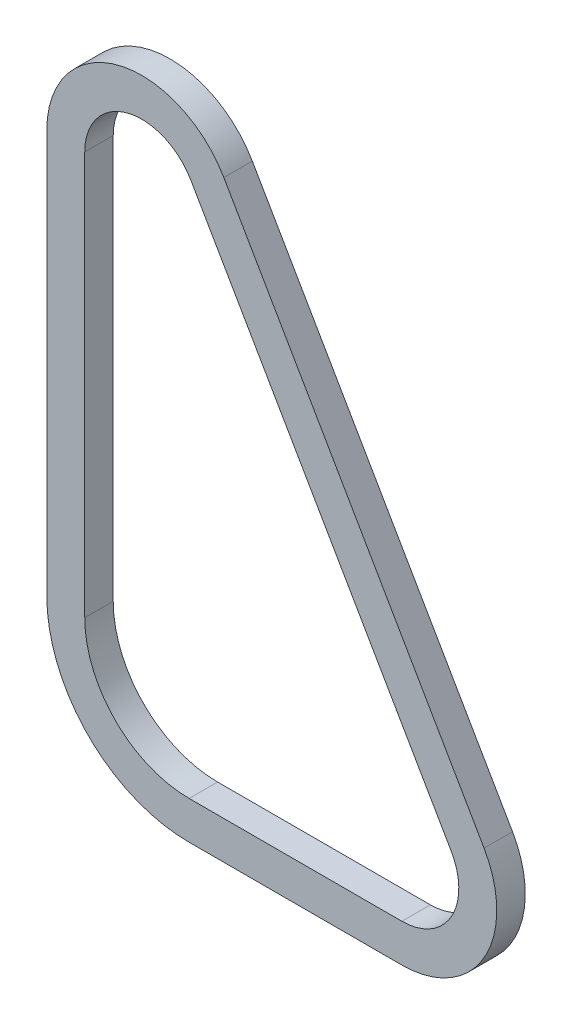
ISO-10303-21;
HEADER;
FILE_DESCRIPTION(('STEP AP214'),'2;1');
FILE_NAME('part.step','',(''),(''),'','','');
FILE_SCHEMA(('AUTOMOTIVE_DESIGN { 1 0 10303 214 1 1 1 1 }'));
ENDSEC;
DATA;
#1=APPLICATION_CONTEXT('core data for automotive mechanical design processes');
#2=APPLICATION_PROTOCOL_DEFINITION('international standard','automotive_design',2000,#1);
#3=PRODUCT_CONTEXT('',#1,'mechanical');
#4=PRODUCT('Part','Part','',(#3));
#5=PRODUCT_RELATED_PRODUCT_CATEGORY('part','',(#4));
#6=PRODUCT_DEFINITION_FORMATION('','',#4);
#7=PRODUCT_DEFINITION_CONTEXT('part definition',#1,'design');
#8=PRODUCT_DEFINITION('design','',#6,#7);
#9=PRODUCT_DEFINITION_SHAPE('','',#8);
#10=(LENGTH_UNIT() NAMED_UNIT(*) SI_UNIT(.MILLI.,.METRE.));
#11=(NAMED_UNIT(*) PLANE_ANGLE_UNIT() SI_UNIT($,.RADIAN.));
#12=(NAMED_UNIT(*) SI_UNIT($,.STERADIAN.) SOLID_ANGLE_UNIT());
#13=UNCERTAINTY_MEASURE_WITH_UNIT(LENGTH_MEASURE(1.E-05),#10,'distance_accuracy_value','');
#14=(GEOMETRIC_REPRESENTATION_CONTEXT(3) GLOBAL_UNCERTAINTY_ASSIGNED_CONTEXT((#13)) GLOBAL_UNIT_ASSIGNED_CONTEXT((#10,
#11,#12)) REPRESENTATION_CONTEXT('',''));
#15=CARTESIAN_POINT('',(0.,0.,0.));
#16=DIRECTION('',(0.,0.,1.));
#17=DIRECTION('',(1.,0.,0.));
#18=AXIS2_PLACEMENT_3D('',#15,#16,#17);
#19=CARTESIAN_POINT('',(-50.,0.,30.));
#20=DIRECTION('',(-1.,0.,0.));
#21=DIRECTION('',(0.,-1.,0.));
#22=AXIS2_PLACEMENT_3D('',#19,#20,#21);
#23=PLANE('',#22);
#24=DIRECTION('',(0.,1.,0.));
#25=VECTOR('',#24,1.);
#26=CARTESIAN_POINT('',(-50.,0.,0.));
#27=LINE('',#26,#25);
#28=CARTESIAN_POINT('',(-50.,-425.,0.));
#29=VERTEX_POINT('',#28);
#30=CARTESIAN_POINT('',(-50.,0.,0.));
#31=VERTEX_POINT('',#30);
#32=EDGE_CURVE('E190',#29,#31,#27,.T.);
#33=ORIENTED_EDGE('',*,*,#32,.F.);
#34=DIRECTION('',(0.,0.,-1.));
#35=VECTOR('',#34,1.);
#36=CARTESIAN_POINT('',(-50.,-425.,30.));
#37=LINE('',#36,#35);
#38=CARTESIAN_POINT('',(-50.,-425.,30.));
#39=VERTEX_POINT('',#38);
#40=EDGE_CURVE('E11',#39,#29,#37,.T.);
#41=ORIENTED_EDGE('',*,*,#40,.F.);
#42=DIRECTION('',(0.,1.,0.));
#43=VECTOR('',#42,1.);
#44=CARTESIAN_POINT('',(-50.,0.,30.));
#45=LINE('',#44,#43);
#46=CARTESIAN_POINT('',(-50.,0.,30.));
#47=VERTEX_POINT('',#46);
#48=EDGE_CURVE('E280',#39,#47,#45,.T.);
#49=ORIENTED_EDGE('',*,*,#48,.T.);
#50=DIRECTION('',(0.,0.,-1.));
#51=VECTOR('',#50,1.);
#52=CARTESIAN_POINT('',(-50.,0.,30.));
#53=LINE('',#52,#51);
#54=EDGE_CURVE('E59',#47,#31,#53,.T.);
#55=ORIENTED_EDGE('',*,*,#54,.T.);
#56=EDGE_LOOP('',(#33,#41,#49,#55));
#57=FACE_BOUND('',#56,.T.);
#58=ADVANCED_FACE('F39',(#57),#23,.T.);
#59=CARTESIAN_POINT('',(100.,-425.,30.));
#60=DIRECTION('',(0.,0.,-1.));
#61=DIRECTION('',(-1.,0.,0.));
#62=AXIS2_PLACEMENT_3D('',#59,#60,#61);
#63=CYLINDRICAL_SURFACE('',#62,150.);
#64=CARTESIAN_POINT('',(100.,-425.,0.));
#65=DIRECTION('',(0.,0.,1.));
#66=DIRECTION('',(1.,0.,0.));
#67=AXIS2_PLACEMENT_3D('',#64,#65,#66);
#68=CIRCLE('',#67,150.);
#69=CARTESIAN_POINT('',(100.,-575.,0.));
#70=VERTEX_POINT('',#69);
#71=EDGE_CURVE('E193',#29,#70,#68,.T.);
#72=ORIENTED_EDGE('',*,*,#71,.T.);
#73=DIRECTION('',(0.,0.,-1.));
#74=VECTOR('',#73,1.);
#75=CARTESIAN_POINT('',(100.,-575.,30.));
#76=LINE('',#75,#74);
#77=CARTESIAN_POINT('',(100.,-575.,30.));
#78=VERTEX_POINT('',#77);
#79=EDGE_CURVE('E50',#78,#70,#76,.T.);
#80=ORIENTED_EDGE('',*,*,#79,.F.);
#81=CARTESIAN_POINT('',(100.,-425.,30.));
#82=DIRECTION('',(0.,0.,1.));
#83=DIRECTION('',(1.,0.,0.));
#84=AXIS2_PLACEMENT_3D('',#81,#82,#83);
#85=CIRCLE('',#84,150.);
#86=EDGE_CURVE('E283',#39,#78,#85,.T.);
#87=ORIENTED_EDGE('',*,*,#86,.F.);
#88=ORIENTED_EDGE('',*,*,#40,.T.);
#89=EDGE_LOOP('',(#72,#80,#87,#88));
#90=FACE_BOUND('',#89,.T.);
#91=ADVANCED_FACE('F303',(#90),#63,.T.);
#92=CARTESIAN_POINT('',(0.,-575.,30.));
#93=DIRECTION('',(0.,-1.,0.));
#94=DIRECTION('',(0.,0.,-1.));
#95=AXIS2_PLACEMENT_3D('',#92,#93,#94);
#96=PLANE('',#95);
#97=DIRECTION('',(-1.,0.,0.));
#98=VECTOR('',#97,1.);
#99=CARTESIAN_POINT('',(0.,-575.,0.));
#100=LINE('',#99,#98);
#101=CARTESIAN_POINT('',(324.241377865075,-575.,0.));
#102=VERTEX_POINT('',#101);
#103=EDGE_CURVE('E197',#102,#70,#100,.T.);
#104=ORIENTED_EDGE('',*,*,#103,.F.);
#105=DIRECTION('',(0.,0.,-1.));
#106=VECTOR('',#105,1.);
#107=CARTESIAN_POINT('',(324.241377865075,-575.,30.));
#108=LINE('',#107,#106);
#109=CARTESIAN_POINT('',(324.241377865075,-575.,30.));
#110=VERTEX_POINT('',#109);
#111=EDGE_CURVE('E147',#110,#102,#108,.T.);
#112=ORIENTED_EDGE('',*,*,#111,.F.);
#113=DIRECTION('',(-1.,0.,0.));
#114=VECTOR('',#113,1.);
#115=CARTESIAN_POINT('',(0.,-575.,30.));
#116=LINE('',#115,#114);
#117=EDGE_CURVE('E157',#110,#78,#116,.T.);
#118=ORIENTED_EDGE('',*,*,#117,.T.);
#119=ORIENTED_EDGE('',*,*,#79,.T.);
#120=EDGE_LOOP('',(#104,#112,#118,#119));
#121=FACE_BOUND('',#120,.T.);
#122=ADVANCED_FACE('F288',(#121),#96,.T.);
#123=CARTESIAN_POINT('',(324.241377865075,-475.,30.));
#124=DIRECTION('',(0.,0.,-1.));
#125=DIRECTION('',(-1.,0.,0.));
#126=AXIS2_PLACEMENT_3D('',#123,#124,#125);
#127=CYLINDRICAL_SURFACE('',#126,100.);
#128=CARTESIAN_POINT('',(324.241377865075,-475.,0.));
#129=DIRECTION('',(0.,0.,1.));
#130=DIRECTION('',(1.,0.,0.));
#131=AXIS2_PLACEMENT_3D('',#128,#129,#130);
#132=CIRCLE('',#131,100.);
#133=CARTESIAN_POINT('',(410.843918243519,-424.999999999999,0.));
#134=VERTEX_POINT('',#133);
#135=EDGE_CURVE('E142',#134,#102,#132,.F.);
#136=ORIENTED_EDGE('',*,*,#135,.F.);
#137=DIRECTION('',(0.,0.,-1.));
#138=VECTOR('',#137,1.);
#139=CARTESIAN_POINT('',(410.843918243519,-424.999999999999,30.));
#140=LINE('',#139,#138);
#141=CARTESIAN_POINT('',(410.843918243519,-424.999999999999,30.));
#142=VERTEX_POINT('',#141);
#143=EDGE_CURVE('E137',#142,#134,#140,.T.);
#144=ORIENTED_EDGE('',*,*,#143,.F.);
#145=CARTESIAN_POINT('',(324.241377865075,-475.,30.));
#146=DIRECTION('',(0.,0.,1.));
#147=DIRECTION('',(1.,0.,0.));
#148=AXIS2_PLACEMENT_3D('',#145,#146,#147);
#149=CIRCLE('',#148,100.);
#150=EDGE_CURVE('E140',#142,#110,#149,.F.);
#151=ORIENTED_EDGE('',*,*,#150,.T.);
#152=ORIENTED_EDGE('',*,*,#111,.T.);
#153=EDGE_LOOP('',(#136,#144,#151,#152));
#154=FACE_BOUND('',#153,.T.);
#155=ADVANCED_FACE('F139',(#154),#127,.T.);
#156=CARTESIAN_POINT('',(124.102540378443,71.6506350946115,30.));
#157=DIRECTION('',(0.866025403784436,0.500000000000004,0.));
#158=DIRECTION('',(-0.500000000000004,0.866025403784436,0.));
#159=AXIS2_PLACEMENT_3D('',#156,#157,#158);
#160=PLANE('',#159);
#161=DIRECTION('',(0.500000000000005,-0.866025403784436,0.));
#162=VECTOR('',#161,1.);
#163=CARTESIAN_POINT('',(124.102540378443,71.6506350946115,0.));
#164=LINE('',#163,#162);
#165=CARTESIAN_POINT('',(136.602540378444,50.0000000000004,0.));
#166=VERTEX_POINT('',#165);
#167=EDGE_CURVE('E203',#166,#134,#164,.T.);
#168=ORIENTED_EDGE('',*,*,#167,.F.);
#169=DIRECTION('',(0.,0.,-1.));
#170=VECTOR('',#169,1.);
#171=CARTESIAN_POINT('',(136.602540378444,50.0000000000004,30.));
#172=LINE('',#171,#170);
#173=CARTESIAN_POINT('',(136.602540378444,50.0000000000004,30.));
#174=VERTEX_POINT('',#173);
#175=EDGE_CURVE('E96',#174,#166,#172,.T.);
#176=ORIENTED_EDGE('',*,*,#175,.F.);
#177=DIRECTION('',(0.500000000000005,-0.866025403784436,0.));
#178=VECTOR('',#177,1.);
#179=CARTESIAN_POINT('',(124.102540378443,71.6506350946115,30.));
#180=LINE('',#179,#178);
#181=EDGE_CURVE('E155',#174,#142,#180,.T.);
#182=ORIENTED_EDGE('',*,*,#181,.T.);
#183=ORIENTED_EDGE('',*,*,#143,.T.);
#184=EDGE_LOOP('',(#168,#176,#182,#183));
#185=FACE_BOUND('',#184,.T.);
#186=ADVANCED_FACE('F160',(#185),#160,.T.);
#187=CARTESIAN_POINT('',(-10.,0.,30.));
#188=DIRECTION('',(-1.,0.,0.));
#189=DIRECTION('',(0.,-1.,0.));
#190=AXIS2_PLACEMENT_3D('',#187,#188,#189);
#191=PLANE('',#190);
#192=DIRECTION('',(0.,1.,0.));
#193=VECTOR('',#192,1.);
#194=CARTESIAN_POINT('',(-10.,0.,0.));
#195=LINE('',#194,#193);
#196=CARTESIAN_POINT('',(-9.99999999999998,-425.,0.));
#197=VERTEX_POINT('',#196);
#198=CARTESIAN_POINT('',(-10.,0.,0.));
#199=VERTEX_POINT('',#198);
#200=EDGE_CURVE('E169',#197,#199,#195,.T.);
#201=ORIENTED_EDGE('',*,*,#200,.T.);
#202=DIRECTION('',(0.,0.,-1.));
#203=VECTOR('',#202,1.);
#204=CARTESIAN_POINT('',(-10.,0.,30.));
#205=LINE('',#204,#203);
#206=CARTESIAN_POINT('',(-10.,0.,30.));
#207=VERTEX_POINT('',#206);
#208=EDGE_CURVE('E43',#207,#199,#205,.T.);
#209=ORIENTED_EDGE('',*,*,#208,.F.);
#210=DIRECTION('',(0.,1.,0.));
#211=VECTOR('',#210,1.);
#212=CARTESIAN_POINT('',(-10.,0.,30.));
#213=LINE('',#212,#211);
#214=CARTESIAN_POINT('',(-9.99999999999998,-425.,30.));
#215=VERTEX_POINT('',#214);
#216=EDGE_CURVE('E210',#215,#207,#213,.T.);
#217=ORIENTED_EDGE('',*,*,#216,.F.);
#218=DIRECTION('',(0.,0.,-1.));
#219=VECTOR('',#218,1.);
#220=CARTESIAN_POINT('',(-9.99999999999998,-425.,30.));
#221=LINE('',#220,#219);
#222=EDGE_CURVE('E165',#215,#197,#221,.T.);
#223=ORIENTED_EDGE('',*,*,#222,.T.);
#224=EDGE_LOOP('',(#201,#209,#217,#223));
#225=FACE_BOUND('',#224,.T.);
#226=ADVANCED_FACE('F41',(#225),#191,.F.);
#227=CARTESIAN_POINT('',(50.,0.,30.));
#228=DIRECTION('',(0.,0.,-1.));
#229=DIRECTION('',(-1.,0.,0.));
#230=AXIS2_PLACEMENT_3D('',#227,#228,#229);
#231=CYLINDRICAL_SURFACE('',#230,60.);
#232=CARTESIAN_POINT('',(50.,0.,0.));
#233=DIRECTION('',(0.,0.,1.));
#234=DIRECTION('',(1.,0.,0.));
#235=AXIS2_PLACEMENT_3D('',#232,#233,#234);
#236=CIRCLE('',#235,60.);
#237=CARTESIAN_POINT('',(101.961524227066,30.0000000000003,0.));
#238=VERTEX_POINT('',#237);
#239=EDGE_CURVE('E173',#199,#238,#236,.F.);
#240=ORIENTED_EDGE('',*,*,#239,.T.);
#241=DIRECTION('',(0.,0.,-1.));
#242=VECTOR('',#241,1.);
#243=CARTESIAN_POINT('',(101.961524227066,30.0000000000003,30.));
#244=LINE('',#243,#242);
#245=CARTESIAN_POINT('',(101.961524227066,30.0000000000003,30.));
#246=VERTEX_POINT('',#245);
#247=EDGE_CURVE('E231',#246,#238,#244,.T.);
#248=ORIENTED_EDGE('',*,*,#247,.F.);
#249=CARTESIAN_POINT('',(50.,0.,30.));
#250=DIRECTION('',(0.,0.,1.));
#251=DIRECTION('',(1.,0.,0.));
#252=AXIS2_PLACEMENT_3D('',#249,#250,#251);
#253=CIRCLE('',#252,60.);
#254=EDGE_CURVE('E109',#207,#246,#253,.F.);
#255=ORIENTED_EDGE('',*,*,#254,.F.);
#256=ORIENTED_EDGE('',*,*,#208,.T.);
#257=EDGE_LOOP('',(#240,#248,#255,#256));
#258=FACE_BOUND('',#257,.T.);
#259=ADVANCED_FACE('F239',(#258),#231,.F.);
#260=CARTESIAN_POINT('',(89.4615242270663,51.650635094611,30.));
#261=DIRECTION('',(0.866025403784439,0.5,0.));
#262=DIRECTION('',(-0.5,0.866025403784439,0.));
#263=AXIS2_PLACEMENT_3D('',#260,#261,#262);
#264=PLANE('',#263);
#265=DIRECTION('',(0.5,-0.866025403784439,0.));
#266=VECTOR('',#265,1.);
#267=CARTESIAN_POINT('',(89.4615242270663,51.650635094611,0.));
#268=LINE('',#267,#266);
#269=CARTESIAN_POINT('',(376.202902092139,-445.000000000001,0.));
#270=VERTEX_POINT('',#269);
#271=EDGE_CURVE('E176',#238,#270,#268,.T.);
#272=ORIENTED_EDGE('',*,*,#271,.T.);
#273=DIRECTION('',(0.,0.,-1.));
#274=VECTOR('',#273,1.);
#275=CARTESIAN_POINT('',(376.202902092139,-445.000000000001,30.));
#276=LINE('',#275,#274);
#277=CARTESIAN_POINT('',(376.202902092139,-445.000000000001,30.));
#278=VERTEX_POINT('',#277);
#279=EDGE_CURVE('E228',#278,#270,#276,.T.);
#280=ORIENTED_EDGE('',*,*,#279,.F.);
#281=DIRECTION('',(0.5,-0.866025403784439,0.));
#282=VECTOR('',#281,1.);
#283=CARTESIAN_POINT('',(89.4615242270663,51.650635094611,30.));
#284=LINE('',#283,#282);
#285=EDGE_CURVE('E265',#246,#278,#284,.T.);
#286=ORIENTED_EDGE('',*,*,#285,.F.);
#287=ORIENTED_EDGE('',*,*,#247,.T.);
#288=EDGE_LOOP('',(#272,#280,#286,#287));
#289=FACE_BOUND('',#288,.T.);
#290=ADVANCED_FACE('F264',(#289),#264,.F.);
#291=CARTESIAN_POINT('',(324.241377865075,-475.,30.));
#292=DIRECTION('',(0.,0.,-1.));
#293=DIRECTION('',(-1.,0.,0.));
#294=AXIS2_PLACEMENT_3D('',#291,#292,#293);
#295=CYLINDRICAL_SURFACE('',#294,59.9999999999987);
#296=CARTESIAN_POINT('',(324.241377865075,-475.,0.));
#297=DIRECTION('',(0.,0.,1.));
#298=DIRECTION('',(1.,0.,0.));
#299=AXIS2_PLACEMENT_3D('',#296,#297,#298);
#300=CIRCLE('',#299,59.9999999999987);
#301=CARTESIAN_POINT('',(324.241377865075,-535.,0.));
#302=VERTEX_POINT('',#301);
#303=EDGE_CURVE('E179',#270,#302,#300,.F.);
#304=ORIENTED_EDGE('',*,*,#303,.T.);
#305=DIRECTION('',(0.,0.,-1.));
#306=VECTOR('',#305,1.);
#307=CARTESIAN_POINT('',(324.241377865075,-535.,30.));
#308=LINE('',#307,#306);
#309=CARTESIAN_POINT('',(324.241377865075,-535.,30.));
#310=VERTEX_POINT('',#309);
#311=EDGE_CURVE('E224',#310,#302,#308,.T.);
#312=ORIENTED_EDGE('',*,*,#311,.F.);
#313=CARTESIAN_POINT('',(324.241377865075,-475.,30.));
#314=DIRECTION('',(0.,0.,1.));
#315=DIRECTION('',(1.,0.,0.));
#316=AXIS2_PLACEMENT_3D('',#313,#314,#315);
#317=CIRCLE('',#316,59.9999999999987);
#318=EDGE_CURVE('E263',#278,#310,#317,.F.);
#319=ORIENTED_EDGE('',*,*,#318,.F.);
#320=ORIENTED_EDGE('',*,*,#279,.T.);
#321=EDGE_LOOP('',(#304,#312,#319,#320));
#322=FACE_BOUND('',#321,.T.);
#323=ADVANCED_FACE('F260',(#322),#295,.F.);
#324=CARTESIAN_POINT('',(0.,-535.,30.));
#325=DIRECTION('',(0.,-1.,0.));
#326=DIRECTION('',(0.,0.,-1.));
#327=AXIS2_PLACEMENT_3D('',#324,#325,#326);
#328=PLANE('',#327);
#329=DIRECTION('',(-1.,0.,0.));
#330=VECTOR('',#329,1.);
#331=CARTESIAN_POINT('',(0.,-535.,0.));
#332=LINE('',#331,#330);
#333=CARTESIAN_POINT('',(100.,-535.,0.));
#334=VERTEX_POINT('',#333);
#335=EDGE_CURVE('E182',#302,#334,#332,.T.);
#336=ORIENTED_EDGE('',*,*,#335,.T.);
#337=DIRECTION('',(0.,0.,-1.));
#338=VECTOR('',#337,1.);
#339=CARTESIAN_POINT('',(100.,-535.,30.));
#340=LINE('',#339,#338);
#341=CARTESIAN_POINT('',(100.,-535.,30.));
#342=VERTEX_POINT('',#341);
#343=EDGE_CURVE('E221',#342,#334,#340,.T.);
#344=ORIENTED_EDGE('',*,*,#343,.F.);
#345=DIRECTION('',(-1.,0.,0.));
#346=VECTOR('',#345,1.);
#347=CARTESIAN_POINT('',(0.,-535.,30.));
#348=LINE('',#347,#346);
#349=EDGE_CURVE('E271',#310,#342,#348,.T.);
#350=ORIENTED_EDGE('',*,*,#349,.F.);
#351=ORIENTED_EDGE('',*,*,#311,.T.);
#352=EDGE_LOOP('',(#336,#344,#350,#351));
#353=FACE_BOUND('',#352,.T.);
#354=ADVANCED_FACE('F256',(#353),#328,.F.);
#355=CARTESIAN_POINT('',(100.,-425.,30.));
#356=DIRECTION('',(0.,0.,-1.));
#357=DIRECTION('',(-1.,0.,0.));
#358=AXIS2_PLACEMENT_3D('',#355,#356,#357);
#359=CYLINDRICAL_SURFACE('',#358,110.);
#360=CARTESIAN_POINT('',(100.,-425.,0.));
#361=DIRECTION('',(0.,0.,1.));
#362=DIRECTION('',(1.,0.,0.));
#363=AXIS2_PLACEMENT_3D('',#360,#361,#362);
#364=CIRCLE('',#363,110.);
#365=EDGE_CURVE('E186',#197,#334,#364,.T.);
#366=ORIENTED_EDGE('',*,*,#365,.F.);
#367=ORIENTED_EDGE('',*,*,#222,.F.);
#368=CARTESIAN_POINT('',(100.,-425.,30.));
#369=DIRECTION('',(0.,0.,1.));
#370=DIRECTION('',(1.,0.,0.));
#371=AXIS2_PLACEMENT_3D('',#368,#369,#370);
#372=CIRCLE('',#371,110.);
#373=EDGE_CURVE('E253',#215,#342,#372,.T.);
#374=ORIENTED_EDGE('',*,*,#373,.T.);
#375=ORIENTED_EDGE('',*,*,#343,.T.);
#376=EDGE_LOOP('',(#366,#367,#374,#375));
#377=FACE_BOUND('',#376,.T.);
#378=ADVANCED_FACE('F249',(#377),#359,.F.);
#379=CARTESIAN_POINT('',(50.,0.,30.));
#380=DIRECTION('',(0.,0.,-1.));
#381=DIRECTION('',(-1.,0.,0.));
#382=AXIS2_PLACEMENT_3D('',#379,#380,#381);
#383=CYLINDRICAL_SURFACE('',#382,100.);
#384=CARTESIAN_POINT('',(50.,0.,0.));
#385=DIRECTION('',(0.,0.,1.));
#386=DIRECTION('',(1.,0.,0.));
#387=AXIS2_PLACEMENT_3D('',#384,#385,#386);
#388=CIRCLE('',#387,100.);
#389=EDGE_CURVE('E206',#31,#166,#388,.F.);
#390=ORIENTED_EDGE('',*,*,#389,.F.);
#391=ORIENTED_EDGE('',*,*,#54,.F.);
#392=CARTESIAN_POINT('',(50.,0.,30.));
#393=DIRECTION('',(0.,0.,1.));
#394=DIRECTION('',(1.,0.,0.));
#395=AXIS2_PLACEMENT_3D('',#392,#393,#394);
#396=CIRCLE('',#395,100.);
#397=EDGE_CURVE('E162',#47,#174,#396,.F.);
#398=ORIENTED_EDGE('',*,*,#397,.T.);
#399=ORIENTED_EDGE('',*,*,#175,.T.);
#400=EDGE_LOOP('',(#390,#391,#398,#399));
#401=FACE_BOUND('',#400,.T.);
#402=ADVANCED_FACE('F291',(#401),#383,.T.);
#403=CARTESIAN_POINT('',(0.,0.,30.));
#404=DIRECTION('',(0.,0.,1.));
#405=DIRECTION('',(1.,0.,0.));
#406=AXIS2_PLACEMENT_3D('',#403,#404,#405);
#407=PLANE('',#406);
#408=ORIENTED_EDGE('',*,*,#216,.T.);
#409=ORIENTED_EDGE('',*,*,#254,.T.);
#410=ORIENTED_EDGE('',*,*,#285,.T.);
#411=ORIENTED_EDGE('',*,*,#318,.T.);
#412=ORIENTED_EDGE('',*,*,#349,.T.);
#413=ORIENTED_EDGE('',*,*,#373,.F.);
#414=EDGE_LOOP('',(#408,#409,#410,#411,#412,#413));
#415=FACE_BOUND('',#414,.T.);
#416=ORIENTED_EDGE('',*,*,#48,.F.);
#417=ORIENTED_EDGE('',*,*,#86,.T.);
#418=ORIENTED_EDGE('',*,*,#117,.F.);
#419=ORIENTED_EDGE('',*,*,#150,.F.);
#420=ORIENTED_EDGE('',*,*,#181,.F.);
#421=ORIENTED_EDGE('',*,*,#397,.F.);
#422=EDGE_LOOP('',(#416,#417,#418,#419,#420,#421));
#423=FACE_BOUND('',#422,.T.);
#424=ADVANCED_FACE('F153',(#415,#423),#407,.T.);
#425=CARTESIAN_POINT('',(0.,0.,0.));
#426=DIRECTION('',(0.,0.,1.));
#427=DIRECTION('',(1.,0.,0.));
#428=AXIS2_PLACEMENT_3D('',#425,#426,#427);
#429=PLANE('',#428);
#430=ORIENTED_EDGE('',*,*,#200,.F.);
#431=ORIENTED_EDGE('',*,*,#365,.T.);
#432=ORIENTED_EDGE('',*,*,#335,.F.);
#433=ORIENTED_EDGE('',*,*,#303,.F.);
#434=ORIENTED_EDGE('',*,*,#271,.F.);
#435=ORIENTED_EDGE('',*,*,#239,.F.);
#436=EDGE_LOOP('',(#430,#431,#432,#433,#434,#435));
#437=FACE_BOUND('',#436,.T.);
#438=ORIENTED_EDGE('',*,*,#32,.T.);
#439=ORIENTED_EDGE('',*,*,#389,.T.);
#440=ORIENTED_EDGE('',*,*,#167,.T.);
#441=ORIENTED_EDGE('',*,*,#135,.T.);
#442=ORIENTED_EDGE('',*,*,#103,.T.);
#443=ORIENTED_EDGE('',*,*,#71,.F.);
#444=EDGE_LOOP('',(#438,#439,#440,#441,#442,#443));
#445=FACE_BOUND('',#444,.T.);
#446=ADVANCED_FACE('F245',(#437,#445),#429,.F.);
#447=CLOSED_SHELL('',(#58,#91,#122,#155,#186,#226,#259,#290,#323,#354,#378,#402,#424,#446));
#448=MANIFOLD_SOLID_BREP('B2',#447);
#449=ADVANCED_BREP_SHAPE_REPRESENTATION('',(#18,#448),#14);
#450=SHAPE_DEFINITION_REPRESENTATION(#9,#449);
ENDSEC;
END-ISO-10303-21;
